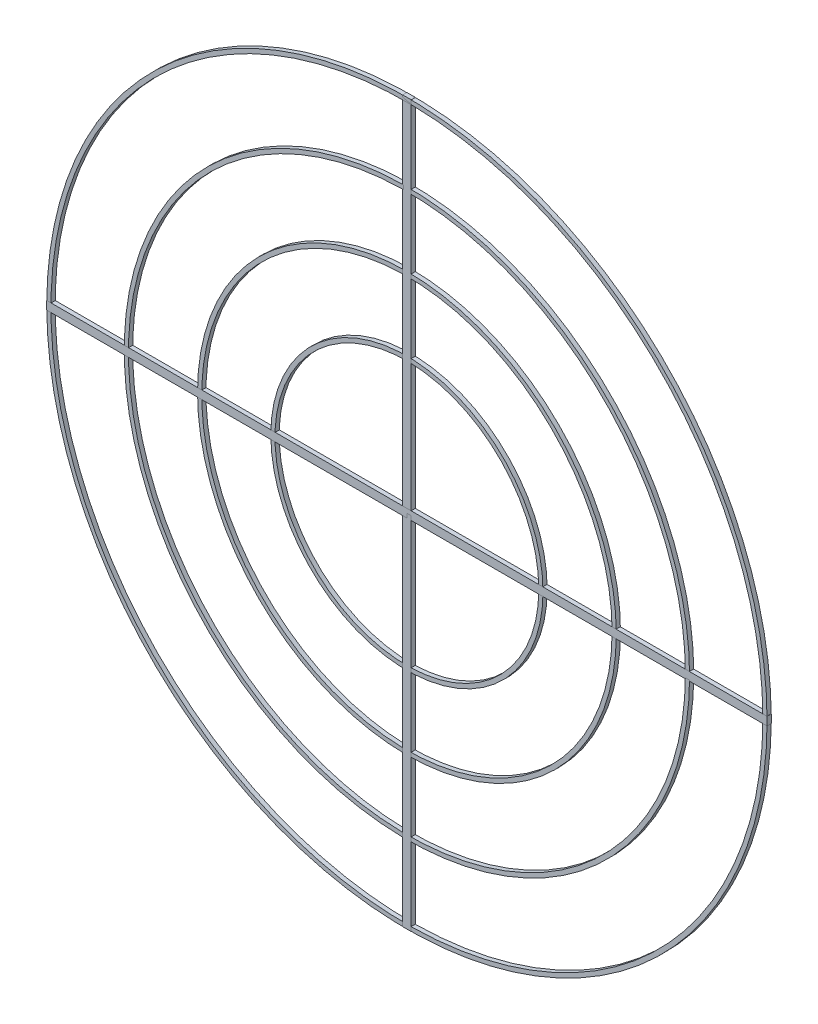
ISO-10303-21;
HEADER;
FILE_DESCRIPTION(('STEP AP214'),'2;1');
FILE_NAME('part.step','',(''),(''),'','','');
FILE_SCHEMA(('AUTOMOTIVE_DESIGN { 1 0 10303 214 1 1 1 1 }'));
ENDSEC;
DATA;
#1=APPLICATION_CONTEXT('core data for automotive mechanical design processes');
#2=APPLICATION_PROTOCOL_DEFINITION('international standard','automotive_design',2000,#1);
#3=PRODUCT_CONTEXT('',#1,'mechanical');
#4=PRODUCT('Part','Part','',(#3));
#5=PRODUCT_RELATED_PRODUCT_CATEGORY('part','',(#4));
#6=PRODUCT_DEFINITION_FORMATION('','',#4);
#7=PRODUCT_DEFINITION_CONTEXT('part definition',#1,'design');
#8=PRODUCT_DEFINITION('design','',#6,#7);
#9=PRODUCT_DEFINITION_SHAPE('','',#8);
#10=(LENGTH_UNIT() NAMED_UNIT(*) SI_UNIT(.MILLI.,.METRE.));
#11=(NAMED_UNIT(*) PLANE_ANGLE_UNIT() SI_UNIT($,.RADIAN.));
#12=(NAMED_UNIT(*) SI_UNIT($,.STERADIAN.) SOLID_ANGLE_UNIT());
#13=UNCERTAINTY_MEASURE_WITH_UNIT(LENGTH_MEASURE(1.E-05),#10,'distance_accuracy_value','');
#14=(GEOMETRIC_REPRESENTATION_CONTEXT(3) GLOBAL_UNCERTAINTY_ASSIGNED_CONTEXT((#13)) GLOBAL_UNIT_ASSIGNED_CONTEXT((#10,
#11,#12)) REPRESENTATION_CONTEXT('',''));
#15=CARTESIAN_POINT('',(0.,0.,0.));
#16=DIRECTION('',(0.,0.,1.));
#17=DIRECTION('',(1.,0.,0.));
#18=AXIS2_PLACEMENT_3D('',#15,#16,#17);
#19=CARTESIAN_POINT('',(-2.,78.,452.));
#20=DIRECTION('',(1.,0.,0.));
#21=DIRECTION('',(0.,0.,-1.));
#22=AXIS2_PLACEMENT_3D('',#19,#20,#21);
#23=PLANE('',#22);
#24=DIRECTION('',(0.,-1.,0.));
#25=VECTOR('',#24,1.);
#26=CARTESIAN_POINT('',(-2.,78.,450.));
#27=LINE('',#26,#25);
#28=CARTESIAN_POINT('',(-2.,422.,450.));
#29=VERTEX_POINT('',#28);
#30=CARTESIAN_POINT('',(-2.,78.,450.));
#31=VERTEX_POINT('',#30);
#32=EDGE_CURVE('E125',#29,#31,#27,.T.);
#33=ORIENTED_EDGE('',*,*,#32,.T.);
#34=DIRECTION('',(0.,0.,-1.));
#35=VECTOR('',#34,1.);
#36=CARTESIAN_POINT('',(-2.,78.,452.));
#37=LINE('',#36,#35);
#38=CARTESIAN_POINT('',(-2.,78.,452.));
#39=VERTEX_POINT('',#38);
#40=EDGE_CURVE('E12',#39,#31,#37,.T.);
#41=ORIENTED_EDGE('',*,*,#40,.F.);
#42=DIRECTION('',(0.,-1.,0.));
#43=VECTOR('',#42,1.);
#44=CARTESIAN_POINT('',(-2.,78.,452.));
#45=LINE('',#44,#43);
#46=CARTESIAN_POINT('',(-2.,422.,452.));
#47=VERTEX_POINT('',#46);
#48=EDGE_CURVE('E106',#47,#39,#45,.T.);
#49=ORIENTED_EDGE('',*,*,#48,.F.);
#50=DIRECTION('',(0.,0.,-1.));
#51=VECTOR('',#50,1.);
#52=CARTESIAN_POINT('',(-2.,422.,452.));
#53=LINE('',#52,#51);
#54=EDGE_CURVE('E117',#47,#29,#53,.T.);
#55=ORIENTED_EDGE('',*,*,#54,.T.);
#56=EDGE_LOOP('',(#33,#41,#49,#55));
#57=FACE_BOUND('',#56,.T.);
#58=ADVANCED_FACE('F53',(#57),#23,.F.);
#59=CARTESIAN_POINT('',(-2.,78.,452.));
#60=DIRECTION('',(0.,1.,0.));
#61=DIRECTION('',(0.,0.,1.));
#62=AXIS2_PLACEMENT_3D('',#59,#60,#61);
#63=PLANE('',#62);
#64=DIRECTION('',(1.,0.,0.));
#65=VECTOR('',#64,1.);
#66=CARTESIAN_POINT('',(-2.,78.,450.));
#67=LINE('',#66,#65);
#68=CARTESIAN_POINT('',(2.,78.,450.));
#69=VERTEX_POINT('',#68);
#70=EDGE_CURVE('E112',#31,#69,#67,.T.);
#71=ORIENTED_EDGE('',*,*,#70,.T.);
#72=DIRECTION('',(0.,0.,-1.));
#73=VECTOR('',#72,1.);
#74=CARTESIAN_POINT('',(2.,78.,452.));
#75=LINE('',#74,#73);
#76=CARTESIAN_POINT('',(2.,78.,452.));
#77=VERTEX_POINT('',#76);
#78=EDGE_CURVE('E61',#77,#69,#75,.T.);
#79=ORIENTED_EDGE('',*,*,#78,.F.);
#80=DIRECTION('',(1.,0.,0.));
#81=VECTOR('',#80,1.);
#82=CARTESIAN_POINT('',(-2.,78.,452.));
#83=LINE('',#82,#81);
#84=EDGE_CURVE('E101',#39,#77,#83,.T.);
#85=ORIENTED_EDGE('',*,*,#84,.F.);
#86=ORIENTED_EDGE('',*,*,#40,.T.);
#87=EDGE_LOOP('',(#71,#79,#85,#86));
#88=FACE_BOUND('',#87,.T.);
#89=ADVANCED_FACE('F109',(#88),#63,.F.);
#90=CARTESIAN_POINT('',(2.,78.,452.));
#91=DIRECTION('',(-1.,0.,0.));
#92=DIRECTION('',(0.,0.,1.));
#93=AXIS2_PLACEMENT_3D('',#90,#91,#92);
#94=PLANE('',#93);
#95=DIRECTION('',(0.,1.,0.));
#96=VECTOR('',#95,1.);
#97=CARTESIAN_POINT('',(2.,78.,450.));
#98=LINE('',#97,#96);
#99=CARTESIAN_POINT('',(2.,422.,450.));
#100=VERTEX_POINT('',#99);
#101=EDGE_CURVE('E86',#69,#100,#98,.T.);
#102=ORIENTED_EDGE('',*,*,#101,.T.);
#103=DIRECTION('',(0.,0.,-1.));
#104=VECTOR('',#103,1.);
#105=CARTESIAN_POINT('',(2.,422.,452.));
#106=LINE('',#105,#104);
#107=CARTESIAN_POINT('',(2.,422.,452.));
#108=VERTEX_POINT('',#107);
#109=EDGE_CURVE('E114',#108,#100,#106,.T.);
#110=ORIENTED_EDGE('',*,*,#109,.F.);
#111=DIRECTION('',(0.,1.,0.));
#112=VECTOR('',#111,1.);
#113=CARTESIAN_POINT('',(2.,78.,452.));
#114=LINE('',#113,#112);
#115=EDGE_CURVE('E102',#77,#108,#114,.T.);
#116=ORIENTED_EDGE('',*,*,#115,.F.);
#117=ORIENTED_EDGE('',*,*,#78,.T.);
#118=EDGE_LOOP('',(#102,#110,#116,#117));
#119=FACE_BOUND('',#118,.T.);
#120=ADVANCED_FACE('F111',(#119),#94,.F.);
#121=CARTESIAN_POINT('',(-2.,422.,452.));
#122=DIRECTION('',(0.,-1.,0.));
#123=DIRECTION('',(0.,0.,-1.));
#124=AXIS2_PLACEMENT_3D('',#121,#122,#123);
#125=PLANE('',#124);
#126=DIRECTION('',(-1.,0.,0.));
#127=VECTOR('',#126,1.);
#128=CARTESIAN_POINT('',(-2.,422.,450.));
#129=LINE('',#128,#127);
#130=EDGE_CURVE('E94',#100,#29,#129,.T.);
#131=ORIENTED_EDGE('',*,*,#130,.T.);
#132=ORIENTED_EDGE('',*,*,#54,.F.);
#133=DIRECTION('',(-1.,0.,0.));
#134=VECTOR('',#133,1.);
#135=CARTESIAN_POINT('',(-2.,422.,452.));
#136=LINE('',#135,#134);
#137=EDGE_CURVE('E72',#108,#47,#136,.T.);
#138=ORIENTED_EDGE('',*,*,#137,.F.);
#139=ORIENTED_EDGE('',*,*,#109,.T.);
#140=EDGE_LOOP('',(#131,#132,#138,#139));
#141=FACE_BOUND('',#140,.T.);
#142=ADVANCED_FACE('F134',(#141),#125,.F.);
#143=CARTESIAN_POINT('',(0.,0.,452.));
#144=DIRECTION('',(0.,0.,-1.));
#145=DIRECTION('',(-1.,0.,0.));
#146=AXIS2_PLACEMENT_3D('',#143,#144,#145);
#147=PLANE('',#146);
#148=ORIENTED_EDGE('',*,*,#48,.T.);
#149=ORIENTED_EDGE('',*,*,#84,.T.);
#150=ORIENTED_EDGE('',*,*,#115,.T.);
#151=ORIENTED_EDGE('',*,*,#137,.T.);
#152=EDGE_LOOP('',(#148,#149,#150,#151));
#153=FACE_BOUND('',#152,.T.);
#154=ADVANCED_FACE('F105',(#153),#147,.F.);
#155=CARTESIAN_POINT('',(0.,0.,450.));
#156=DIRECTION('',(0.,0.,-1.));
#157=DIRECTION('',(-1.,0.,0.));
#158=AXIS2_PLACEMENT_3D('',#155,#156,#157);
#159=PLANE('',#158);
#160=ORIENTED_EDGE('',*,*,#32,.F.);
#161=ORIENTED_EDGE('',*,*,#130,.F.);
#162=ORIENTED_EDGE('',*,*,#101,.F.);
#163=ORIENTED_EDGE('',*,*,#70,.F.);
#164=EDGE_LOOP('',(#160,#161,#162,#163));
#165=FACE_BOUND('',#164,.T.);
#166=ADVANCED_FACE('F140',(#165),#159,.T.);
#167=CLOSED_SHELL('',(#58,#89,#120,#142,#154,#166));
#168=MANIFOLD_SOLID_BREP('B2',#167);
#169=CARTESIAN_POINT('',(-172.,248.,452.));
#170=DIRECTION('',(1.,0.,0.));
#171=DIRECTION('',(0.,0.,-1.));
#172=AXIS2_PLACEMENT_3D('',#169,#170,#171);
#173=PLANE('',#172);
#174=DIRECTION('',(0.,-1.,0.));
#175=VECTOR('',#174,1.);
#176=CARTESIAN_POINT('',(-172.,248.,450.));
#177=LINE('',#176,#175);
#178=CARTESIAN_POINT('',(-172.,252.,450.));
#179=VERTEX_POINT('',#178);
#180=CARTESIAN_POINT('',(-172.,248.,450.));
#181=VERTEX_POINT('',#180);
#182=EDGE_CURVE('E273',#179,#181,#177,.T.);
#183=ORIENTED_EDGE('',*,*,#182,.T.);
#184=DIRECTION('',(0.,0.,-1.));
#185=VECTOR('',#184,1.);
#186=CARTESIAN_POINT('',(-172.,248.,452.));
#187=LINE('',#186,#185);
#188=CARTESIAN_POINT('',(-172.,248.,452.));
#189=VERTEX_POINT('',#188);
#190=EDGE_CURVE('E55',#189,#181,#187,.T.);
#191=ORIENTED_EDGE('',*,*,#190,.F.);
#192=DIRECTION('',(0.,-1.,0.));
#193=VECTOR('',#192,1.);
#194=CARTESIAN_POINT('',(-172.,248.,452.));
#195=LINE('',#194,#193);
#196=CARTESIAN_POINT('',(-172.,252.,452.));
#197=VERTEX_POINT('',#196);
#198=EDGE_CURVE('E258',#197,#189,#195,.T.);
#199=ORIENTED_EDGE('',*,*,#198,.F.);
#200=DIRECTION('',(0.,0.,-1.));
#201=VECTOR('',#200,1.);
#202=CARTESIAN_POINT('',(-172.,252.,452.));
#203=LINE('',#202,#201);
#204=EDGE_CURVE('E269',#197,#179,#203,.T.);
#205=ORIENTED_EDGE('',*,*,#204,.T.);
#206=EDGE_LOOP('',(#183,#191,#199,#205));
#207=FACE_BOUND('',#206,.T.);
#208=ADVANCED_FACE('F204',(#207),#173,.F.);
#209=CARTESIAN_POINT('',(-172.,248.,452.));
#210=DIRECTION('',(0.,1.,0.));
#211=DIRECTION('',(0.,0.,1.));
#212=AXIS2_PLACEMENT_3D('',#209,#210,#211);
#213=PLANE('',#212);
#214=DIRECTION('',(1.,0.,0.));
#215=VECTOR('',#214,1.);
#216=CARTESIAN_POINT('',(-172.,248.,450.));
#217=LINE('',#216,#215);
#218=CARTESIAN_POINT('',(172.,248.,450.));
#219=VERTEX_POINT('',#218);
#220=EDGE_CURVE('E261',#181,#219,#217,.T.);
#221=ORIENTED_EDGE('',*,*,#220,.T.);
#222=DIRECTION('',(0.,0.,-1.));
#223=VECTOR('',#222,1.);
#224=CARTESIAN_POINT('',(172.,248.,452.));
#225=LINE('',#224,#223);
#226=CARTESIAN_POINT('',(172.,248.,452.));
#227=VERTEX_POINT('',#226);
#228=EDGE_CURVE('E213',#227,#219,#225,.T.);
#229=ORIENTED_EDGE('',*,*,#228,.F.);
#230=DIRECTION('',(1.,0.,0.));
#231=VECTOR('',#230,1.);
#232=CARTESIAN_POINT('',(-172.,248.,452.));
#233=LINE('',#232,#231);
#234=EDGE_CURVE('E253',#189,#227,#233,.T.);
#235=ORIENTED_EDGE('',*,*,#234,.F.);
#236=ORIENTED_EDGE('',*,*,#190,.T.);
#237=EDGE_LOOP('',(#221,#229,#235,#236));
#238=FACE_BOUND('',#237,.T.);
#239=ADVANCED_FACE('F257',(#238),#213,.F.);
#240=CARTESIAN_POINT('',(172.,248.,452.));
#241=DIRECTION('',(-1.,0.,0.));
#242=DIRECTION('',(0.,0.,1.));
#243=AXIS2_PLACEMENT_3D('',#240,#241,#242);
#244=PLANE('',#243);
#245=DIRECTION('',(0.,1.,0.));
#246=VECTOR('',#245,1.);
#247=CARTESIAN_POINT('',(172.,248.,450.));
#248=LINE('',#247,#246);
#249=CARTESIAN_POINT('',(172.,252.,450.));
#250=VERTEX_POINT('',#249);
#251=EDGE_CURVE('E236',#219,#250,#248,.T.);
#252=ORIENTED_EDGE('',*,*,#251,.T.);
#253=DIRECTION('',(0.,0.,-1.));
#254=VECTOR('',#253,1.);
#255=CARTESIAN_POINT('',(172.,252.,452.));
#256=LINE('',#255,#254);
#257=CARTESIAN_POINT('',(172.,252.,452.));
#258=VERTEX_POINT('',#257);
#259=EDGE_CURVE('E263',#258,#250,#256,.T.);
#260=ORIENTED_EDGE('',*,*,#259,.F.);
#261=DIRECTION('',(0.,1.,0.));
#262=VECTOR('',#261,1.);
#263=CARTESIAN_POINT('',(172.,248.,452.));
#264=LINE('',#263,#262);
#265=EDGE_CURVE('E255',#227,#258,#264,.T.);
#266=ORIENTED_EDGE('',*,*,#265,.F.);
#267=ORIENTED_EDGE('',*,*,#228,.T.);
#268=EDGE_LOOP('',(#252,#260,#266,#267));
#269=FACE_BOUND('',#268,.T.);
#270=ADVANCED_FACE('F262',(#269),#244,.F.);
#271=CARTESIAN_POINT('',(-172.,252.,452.));
#272=DIRECTION('',(0.,-1.,0.));
#273=DIRECTION('',(0.,0.,-1.));
#274=AXIS2_PLACEMENT_3D('',#271,#272,#273);
#275=PLANE('',#274);
#276=DIRECTION('',(-1.,0.,0.));
#277=VECTOR('',#276,1.);
#278=CARTESIAN_POINT('',(-172.,252.,450.));
#279=LINE('',#278,#277);
#280=EDGE_CURVE('E242',#250,#179,#279,.T.);
#281=ORIENTED_EDGE('',*,*,#280,.T.);
#282=ORIENTED_EDGE('',*,*,#204,.F.);
#283=DIRECTION('',(-1.,0.,0.));
#284=VECTOR('',#283,1.);
#285=CARTESIAN_POINT('',(-172.,252.,452.));
#286=LINE('',#285,#284);
#287=EDGE_CURVE('E222',#258,#197,#286,.T.);
#288=ORIENTED_EDGE('',*,*,#287,.F.);
#289=ORIENTED_EDGE('',*,*,#259,.T.);
#290=EDGE_LOOP('',(#281,#282,#288,#289));
#291=FACE_BOUND('',#290,.T.);
#292=ADVANCED_FACE('F284',(#291),#275,.F.);
#293=CARTESIAN_POINT('',(0.,0.,452.));
#294=DIRECTION('',(0.,0.,-1.));
#295=DIRECTION('',(-1.,0.,0.));
#296=AXIS2_PLACEMENT_3D('',#293,#294,#295);
#297=PLANE('',#296);
#298=ORIENTED_EDGE('',*,*,#198,.T.);
#299=ORIENTED_EDGE('',*,*,#234,.T.);
#300=ORIENTED_EDGE('',*,*,#265,.T.);
#301=ORIENTED_EDGE('',*,*,#287,.T.);
#302=EDGE_LOOP('',(#298,#299,#300,#301));
#303=FACE_BOUND('',#302,.T.);
#304=ADVANCED_FACE('F252',(#303),#297,.F.);
#305=CARTESIAN_POINT('',(0.,0.,450.));
#306=DIRECTION('',(0.,0.,-1.));
#307=DIRECTION('',(-1.,0.,0.));
#308=AXIS2_PLACEMENT_3D('',#305,#306,#307);
#309=PLANE('',#308);
#310=ORIENTED_EDGE('',*,*,#182,.F.);
#311=ORIENTED_EDGE('',*,*,#280,.F.);
#312=ORIENTED_EDGE('',*,*,#251,.F.);
#313=ORIENTED_EDGE('',*,*,#220,.F.);
#314=EDGE_LOOP('',(#310,#311,#312,#313));
#315=FACE_BOUND('',#314,.T.);
#316=ADVANCED_FACE('F290',(#315),#309,.T.);
#317=CLOSED_SHELL('',(#208,#239,#270,#292,#304,#316));
#318=MANIFOLD_SOLID_BREP('B6',#317);
#319=CARTESIAN_POINT('',(0.,250.,452.));
#320=DIRECTION('',(0.,0.,1.));
#321=DIRECTION('',(1.,0.,0.));
#322=AXIS2_PLACEMENT_3D('',#319,#320,#321);
#323=PLANE('',#322);
#324=CARTESIAN_POINT('',(0.,250.,452.));
#325=DIRECTION('',(0.,0.,1.));
#326=DIRECTION('',(1.,0.,0.));
#327=AXIS2_PLACEMENT_3D('',#324,#325,#326);
#328=CIRCLE('',#327,172.);
#329=CARTESIAN_POINT('',(172.,250.,452.));
#330=VERTEX_POINT('',#329);
#331=EDGE_CURVE('E201',#330,#330,#328,.T.);
#332=ORIENTED_EDGE('',*,*,#331,.T.);
#333=EDGE_LOOP('',(#332));
#334=FACE_BOUND('',#333,.T.);
#335=CARTESIAN_POINT('',(0.,250.,452.));
#336=DIRECTION('',(0.,0.,1.));
#337=DIRECTION('',(1.,0.,0.));
#338=AXIS2_PLACEMENT_3D('',#335,#336,#337);
#339=CIRCLE('',#338,170.);
#340=CARTESIAN_POINT('',(170.,250.,452.));
#341=VERTEX_POINT('',#340);
#342=EDGE_CURVE('E369',#341,#341,#339,.T.);
#343=ORIENTED_EDGE('',*,*,#342,.F.);
#344=EDGE_LOOP('',(#343));
#345=FACE_BOUND('',#344,.T.);
#346=ADVANCED_FACE('F352',(#334,#345),#323,.T.);
#347=CARTESIAN_POINT('',(0.,250.,450.));
#348=DIRECTION('',(0.,0.,1.));
#349=DIRECTION('',(1.,0.,0.));
#350=AXIS2_PLACEMENT_3D('',#347,#348,#349);
#351=PLANE('',#350);
#352=CARTESIAN_POINT('',(0.,250.,450.));
#353=DIRECTION('',(0.,0.,1.));
#354=DIRECTION('',(1.,0.,0.));
#355=AXIS2_PLACEMENT_3D('',#352,#353,#354);
#356=CIRCLE('',#355,172.);
#357=CARTESIAN_POINT('',(172.,250.,450.));
#358=VERTEX_POINT('',#357);
#359=EDGE_CURVE('E360',#358,#358,#356,.T.);
#360=ORIENTED_EDGE('',*,*,#359,.F.);
#361=EDGE_LOOP('',(#360));
#362=FACE_BOUND('',#361,.T.);
#363=CARTESIAN_POINT('',(0.,250.,450.));
#364=DIRECTION('',(0.,0.,1.));
#365=DIRECTION('',(1.,0.,0.));
#366=AXIS2_PLACEMENT_3D('',#363,#364,#365);
#367=CIRCLE('',#366,170.);
#368=CARTESIAN_POINT('',(170.,250.,450.));
#369=VERTEX_POINT('',#368);
#370=EDGE_CURVE('E371',#369,#369,#367,.T.);
#371=ORIENTED_EDGE('',*,*,#370,.T.);
#372=EDGE_LOOP('',(#371));
#373=FACE_BOUND('',#372,.T.);
#374=ADVANCED_FACE('F381',(#362,#373),#351,.F.);
#375=CARTESIAN_POINT('',(0.,250.,452.));
#376=DIRECTION('',(0.,0.,-1.));
#377=DIRECTION('',(-1.,0.,0.));
#378=AXIS2_PLACEMENT_3D('',#375,#376,#377);
#379=CYLINDRICAL_SURFACE('',#378,172.);
#380=ORIENTED_EDGE('',*,*,#331,.F.);
#381=EDGE_LOOP('',(#380));
#382=FACE_BOUND('',#381,.T.);
#383=ORIENTED_EDGE('',*,*,#359,.T.);
#384=EDGE_LOOP('',(#383));
#385=FACE_BOUND('',#384,.T.);
#386=ADVANCED_FACE('F357',(#382,#385),#379,.T.);
#387=CARTESIAN_POINT('',(0.,250.,452.));
#388=DIRECTION('',(0.,0.,-1.));
#389=DIRECTION('',(-1.,0.,0.));
#390=AXIS2_PLACEMENT_3D('',#387,#388,#389);
#391=CYLINDRICAL_SURFACE('',#390,170.);
#392=ORIENTED_EDGE('',*,*,#342,.T.);
#393=EDGE_LOOP('',(#392));
#394=FACE_BOUND('',#393,.T.);
#395=ORIENTED_EDGE('',*,*,#370,.F.);
#396=EDGE_LOOP('',(#395));
#397=FACE_BOUND('',#396,.T.);
#398=ADVANCED_FACE('F380',(#394,#397),#391,.F.);
#399=CLOSED_SHELL('',(#346,#374,#386,#398));
#400=MANIFOLD_SOLID_BREP('B46',#399);
#401=CARTESIAN_POINT('',(0.,250.,452.));
#402=DIRECTION('',(0.,0.,1.));
#403=DIRECTION('',(1.,0.,0.));
#404=AXIS2_PLACEMENT_3D('',#401,#402,#403);
#405=PLANE('',#404);
#406=CARTESIAN_POINT('',(0.,250.,452.));
#407=DIRECTION('',(0.,0.,1.));
#408=DIRECTION('',(1.,0.,0.));
#409=AXIS2_PLACEMENT_3D('',#406,#407,#408);
#410=CIRCLE('',#409,135.);
#411=CARTESIAN_POINT('',(135.,250.,452.));
#412=VERTEX_POINT('',#411);
#413=EDGE_CURVE('E351',#412,#412,#410,.T.);
#414=ORIENTED_EDGE('',*,*,#413,.T.);
#415=EDGE_LOOP('',(#414));
#416=FACE_BOUND('',#415,.T.);
#417=CARTESIAN_POINT('',(0.,250.,452.));
#418=DIRECTION('',(0.,0.,1.));
#419=DIRECTION('',(1.,0.,0.));
#420=AXIS2_PLACEMENT_3D('',#417,#418,#419);
#421=CIRCLE('',#420,133.);
#422=CARTESIAN_POINT('',(133.,250.,452.));
#423=VERTEX_POINT('',#422);
#424=EDGE_CURVE('E448',#423,#423,#421,.T.);
#425=ORIENTED_EDGE('',*,*,#424,.F.);
#426=EDGE_LOOP('',(#425));
#427=FACE_BOUND('',#426,.T.);
#428=ADVANCED_FACE('F435',(#416,#427),#405,.T.);
#429=CARTESIAN_POINT('',(0.,250.,450.));
#430=DIRECTION('',(0.,0.,1.));
#431=DIRECTION('',(1.,0.,0.));
#432=AXIS2_PLACEMENT_3D('',#429,#430,#431);
#433=PLANE('',#432);
#434=CARTESIAN_POINT('',(0.,250.,450.));
#435=DIRECTION('',(0.,0.,1.));
#436=DIRECTION('',(1.,0.,0.));
#437=AXIS2_PLACEMENT_3D('',#434,#435,#436);
#438=CIRCLE('',#437,135.);
#439=CARTESIAN_POINT('',(135.,250.,450.));
#440=VERTEX_POINT('',#439);
#441=EDGE_CURVE('E436',#440,#440,#438,.T.);
#442=ORIENTED_EDGE('',*,*,#441,.F.);
#443=EDGE_LOOP('',(#442));
#444=FACE_BOUND('',#443,.T.);
#445=CARTESIAN_POINT('',(0.,250.,450.));
#446=DIRECTION('',(0.,0.,1.));
#447=DIRECTION('',(1.,0.,0.));
#448=AXIS2_PLACEMENT_3D('',#445,#446,#447);
#449=CIRCLE('',#448,133.);
#450=CARTESIAN_POINT('',(133.,250.,450.));
#451=VERTEX_POINT('',#450);
#452=EDGE_CURVE('E446',#451,#451,#449,.T.);
#453=ORIENTED_EDGE('',*,*,#452,.T.);
#454=EDGE_LOOP('',(#453));
#455=FACE_BOUND('',#454,.T.);
#456=ADVANCED_FACE('F459',(#444,#455),#433,.F.);
#457=CARTESIAN_POINT('',(0.,250.,452.));
#458=DIRECTION('',(0.,0.,-1.));
#459=DIRECTION('',(-1.,0.,0.));
#460=AXIS2_PLACEMENT_3D('',#457,#458,#459);
#461=CYLINDRICAL_SURFACE('',#460,135.);
#462=ORIENTED_EDGE('',*,*,#413,.F.);
#463=EDGE_LOOP('',(#462));
#464=FACE_BOUND('',#463,.T.);
#465=ORIENTED_EDGE('',*,*,#441,.T.);
#466=EDGE_LOOP('',(#465));
#467=FACE_BOUND('',#466,.T.);
#468=ADVANCED_FACE('F432',(#464,#467),#461,.T.);
#469=CARTESIAN_POINT('',(0.,250.,452.));
#470=DIRECTION('',(0.,0.,-1.));
#471=DIRECTION('',(-1.,0.,0.));
#472=AXIS2_PLACEMENT_3D('',#469,#470,#471);
#473=CYLINDRICAL_SURFACE('',#472,133.);
#474=ORIENTED_EDGE('',*,*,#424,.T.);
#475=EDGE_LOOP('',(#474));
#476=FACE_BOUND('',#475,.T.);
#477=ORIENTED_EDGE('',*,*,#452,.F.);
#478=EDGE_LOOP('',(#477));
#479=FACE_BOUND('',#478,.T.);
#480=ADVANCED_FACE('F453',(#476,#479),#473,.F.);
#481=CLOSED_SHELL('',(#428,#456,#468,#480));
#482=MANIFOLD_SOLID_BREP('B196',#481);
#483=CARTESIAN_POINT('',(0.,250.,452.));
#484=DIRECTION('',(0.,0.,1.));
#485=DIRECTION('',(1.,0.,0.));
#486=AXIS2_PLACEMENT_3D('',#483,#484,#485);
#487=PLANE('',#486);
#488=CARTESIAN_POINT('',(0.,250.,452.));
#489=DIRECTION('',(0.,0.,1.));
#490=DIRECTION('',(1.,0.,0.));
#491=AXIS2_PLACEMENT_3D('',#488,#489,#490);
#492=CIRCLE('',#491,100.);
#493=CARTESIAN_POINT('',(100.,250.,452.));
#494=VERTEX_POINT('',#493);
#495=EDGE_CURVE('E431',#494,#494,#492,.T.);
#496=ORIENTED_EDGE('',*,*,#495,.T.);
#497=EDGE_LOOP('',(#496));
#498=FACE_BOUND('',#497,.T.);
#499=CARTESIAN_POINT('',(0.,250.,452.));
#500=DIRECTION('',(0.,0.,1.));
#501=DIRECTION('',(1.,0.,0.));
#502=AXIS2_PLACEMENT_3D('',#499,#500,#501);
#503=CIRCLE('',#502,98.);
#504=CARTESIAN_POINT('',(98.,250.,452.));
#505=VERTEX_POINT('',#504);
#506=EDGE_CURVE('E525',#505,#505,#503,.T.);
#507=ORIENTED_EDGE('',*,*,#506,.F.);
#508=EDGE_LOOP('',(#507));
#509=FACE_BOUND('',#508,.T.);
#510=ADVANCED_FACE('F506',(#498,#509),#487,.T.);
#511=CARTESIAN_POINT('',(0.,250.,450.));
#512=DIRECTION('',(0.,0.,1.));
#513=DIRECTION('',(1.,0.,0.));
#514=AXIS2_PLACEMENT_3D('',#511,#512,#513);
#515=PLANE('',#514);
#516=CARTESIAN_POINT('',(0.,250.,450.));
#517=DIRECTION('',(0.,0.,1.));
#518=DIRECTION('',(1.,0.,0.));
#519=AXIS2_PLACEMENT_3D('',#516,#517,#518);
#520=CIRCLE('',#519,100.);
#521=CARTESIAN_POINT('',(100.,250.,450.));
#522=VERTEX_POINT('',#521);
#523=EDGE_CURVE('E511',#522,#522,#520,.T.);
#524=ORIENTED_EDGE('',*,*,#523,.F.);
#525=EDGE_LOOP('',(#524));
#526=FACE_BOUND('',#525,.T.);
#527=CARTESIAN_POINT('',(0.,250.,450.));
#528=DIRECTION('',(0.,0.,1.));
#529=DIRECTION('',(1.,0.,0.));
#530=AXIS2_PLACEMENT_3D('',#527,#528,#529);
#531=CIRCLE('',#530,98.);
#532=CARTESIAN_POINT('',(98.,250.,450.));
#533=VERTEX_POINT('',#532);
#534=EDGE_CURVE('E523',#533,#533,#531,.T.);
#535=ORIENTED_EDGE('',*,*,#534,.T.);
#536=EDGE_LOOP('',(#535));
#537=FACE_BOUND('',#536,.T.);
#538=ADVANCED_FACE('F536',(#526,#537),#515,.F.);
#539=CARTESIAN_POINT('',(0.,250.,452.));
#540=DIRECTION('',(0.,0.,-1.));
#541=DIRECTION('',(-1.,0.,0.));
#542=AXIS2_PLACEMENT_3D('',#539,#540,#541);
#543=CYLINDRICAL_SURFACE('',#542,100.);
#544=ORIENTED_EDGE('',*,*,#495,.F.);
#545=EDGE_LOOP('',(#544));
#546=FACE_BOUND('',#545,.T.);
#547=ORIENTED_EDGE('',*,*,#523,.T.);
#548=EDGE_LOOP('',(#547));
#549=FACE_BOUND('',#548,.T.);
#550=ADVANCED_FACE('F512',(#546,#549),#543,.T.);
#551=CARTESIAN_POINT('',(0.,250.,452.));
#552=DIRECTION('',(0.,0.,-1.));
#553=DIRECTION('',(-1.,0.,0.));
#554=AXIS2_PLACEMENT_3D('',#551,#552,#553);
#555=CYLINDRICAL_SURFACE('',#554,98.);
#556=ORIENTED_EDGE('',*,*,#506,.T.);
#557=EDGE_LOOP('',(#556));
#558=FACE_BOUND('',#557,.T.);
#559=ORIENTED_EDGE('',*,*,#534,.F.);
#560=EDGE_LOOP('',(#559));
#561=FACE_BOUND('',#560,.T.);
#562=ADVANCED_FACE('F535',(#558,#561),#555,.F.);
#563=CLOSED_SHELL('',(#510,#538,#550,#562));
#564=MANIFOLD_SOLID_BREP('B346',#563);
#565=CARTESIAN_POINT('',(0.,250.,452.));
#566=DIRECTION('',(0.,0.,1.));
#567=DIRECTION('',(1.,0.,0.));
#568=AXIS2_PLACEMENT_3D('',#565,#566,#567);
#569=PLANE('',#568);
#570=CARTESIAN_POINT('',(0.,250.,452.));
#571=DIRECTION('',(0.,0.,1.));
#572=DIRECTION('',(1.,0.,0.));
#573=AXIS2_PLACEMENT_3D('',#570,#571,#572);
#574=CIRCLE('',#573,65.);
#575=CARTESIAN_POINT('',(65.,250.,452.));
#576=VERTEX_POINT('',#575);
#577=EDGE_CURVE('E510',#576,#576,#574,.T.);
#578=ORIENTED_EDGE('',*,*,#577,.T.);
#579=EDGE_LOOP('',(#578));
#580=FACE_BOUND('',#579,.T.);
#581=CARTESIAN_POINT('',(0.,250.,452.));
#582=DIRECTION('',(0.,0.,1.));
#583=DIRECTION('',(1.,0.,0.));
#584=AXIS2_PLACEMENT_3D('',#581,#582,#583);
#585=CIRCLE('',#584,63.);
#586=CARTESIAN_POINT('',(63.,250.,452.));
#587=VERTEX_POINT('',#586);
#588=EDGE_CURVE('E593',#587,#587,#585,.T.);
#589=ORIENTED_EDGE('',*,*,#588,.F.);
#590=EDGE_LOOP('',(#589));
#591=FACE_BOUND('',#590,.T.);
#592=ADVANCED_FACE('F576',(#580,#591),#569,.T.);
#593=CARTESIAN_POINT('',(0.,250.,450.));
#594=DIRECTION('',(0.,0.,1.));
#595=DIRECTION('',(1.,0.,0.));
#596=AXIS2_PLACEMENT_3D('',#593,#594,#595);
#597=PLANE('',#596);
#598=CARTESIAN_POINT('',(0.,250.,450.));
#599=DIRECTION('',(0.,0.,1.));
#600=DIRECTION('',(1.,0.,0.));
#601=AXIS2_PLACEMENT_3D('',#598,#599,#600);
#602=CIRCLE('',#601,65.);
#603=CARTESIAN_POINT('',(65.,250.,450.));
#604=VERTEX_POINT('',#603);
#605=EDGE_CURVE('E581',#604,#604,#602,.T.);
#606=ORIENTED_EDGE('',*,*,#605,.F.);
#607=EDGE_LOOP('',(#606));
#608=FACE_BOUND('',#607,.T.);
#609=CARTESIAN_POINT('',(0.,250.,450.));
#610=DIRECTION('',(0.,0.,1.));
#611=DIRECTION('',(1.,0.,0.));
#612=AXIS2_PLACEMENT_3D('',#609,#610,#611);
#613=CIRCLE('',#612,63.);
#614=CARTESIAN_POINT('',(63.,250.,450.));
#615=VERTEX_POINT('',#614);
#616=EDGE_CURVE('E594',#615,#615,#613,.T.);
#617=ORIENTED_EDGE('',*,*,#616,.T.);
#618=EDGE_LOOP('',(#617));
#619=FACE_BOUND('',#618,.T.);
#620=ADVANCED_FACE('F607',(#608,#619),#597,.F.);
#621=CARTESIAN_POINT('',(0.,250.,452.));
#622=DIRECTION('',(0.,0.,-1.));
#623=DIRECTION('',(-1.,0.,0.));
#624=AXIS2_PLACEMENT_3D('',#621,#622,#623);
#625=CYLINDRICAL_SURFACE('',#624,65.);
#626=ORIENTED_EDGE('',*,*,#577,.F.);
#627=EDGE_LOOP('',(#626));
#628=FACE_BOUND('',#627,.T.);
#629=ORIENTED_EDGE('',*,*,#605,.T.);
#630=EDGE_LOOP('',(#629));
#631=FACE_BOUND('',#630,.T.);
#632=ADVANCED_FACE('F583',(#628,#631),#625,.T.);
#633=CARTESIAN_POINT('',(0.,250.,452.));
#634=DIRECTION('',(0.,0.,-1.));
#635=DIRECTION('',(-1.,0.,0.));
#636=AXIS2_PLACEMENT_3D('',#633,#634,#635);
#637=CYLINDRICAL_SURFACE('',#636,63.);
#638=ORIENTED_EDGE('',*,*,#588,.T.);
#639=EDGE_LOOP('',(#638));
#640=FACE_BOUND('',#639,.T.);
#641=ORIENTED_EDGE('',*,*,#616,.F.);
#642=EDGE_LOOP('',(#641));
#643=FACE_BOUND('',#642,.T.);
#644=ADVANCED_FACE('F605',(#640,#643),#637,.F.);
#645=CLOSED_SHELL('',(#592,#620,#632,#644));
#646=MANIFOLD_SOLID_BREP('B426',#645);
#647=ADVANCED_BREP_SHAPE_REPRESENTATION('',(#18,#168,#318,#400,#482,#564,#646),#14);
#648=SHAPE_DEFINITION_REPRESENTATION(#9,#647);
ENDSEC;
END-ISO-10303-21;
